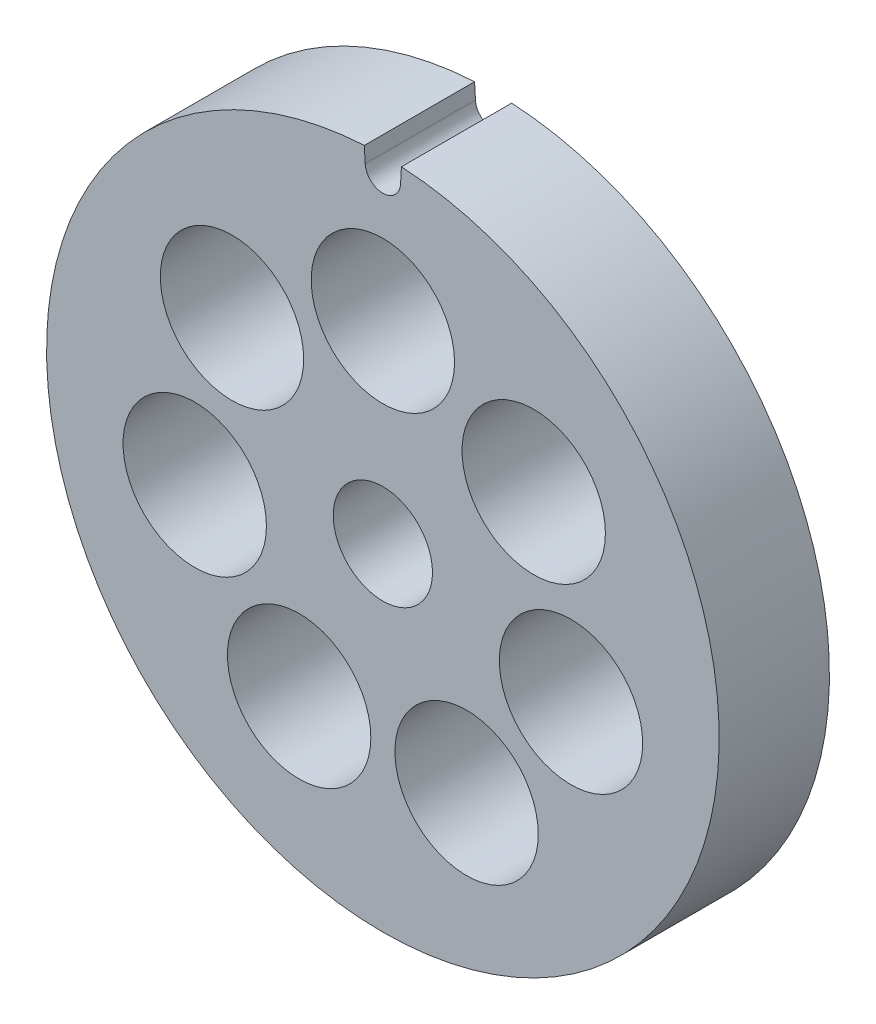
ISO-10303-21;
HEADER;
FILE_DESCRIPTION(('STEP AP214'),'2;1');
FILE_NAME('part.step','',(''),(''),'','','');
FILE_SCHEMA(('AUTOMOTIVE_DESIGN { 1 0 10303 214 1 1 1 1 }'));
ENDSEC;
DATA;
#1=APPLICATION_CONTEXT('core data for automotive mechanical design processes');
#2=APPLICATION_PROTOCOL_DEFINITION('international standard','automotive_design',2000,#1);
#3=PRODUCT_CONTEXT('',#1,'mechanical');
#4=PRODUCT('Part','Part','',(#3));
#5=PRODUCT_RELATED_PRODUCT_CATEGORY('part','',(#4));
#6=PRODUCT_DEFINITION_FORMATION('','',#4);
#7=PRODUCT_DEFINITION_CONTEXT('part definition',#1,'design');
#8=PRODUCT_DEFINITION('design','',#6,#7);
#9=PRODUCT_DEFINITION_SHAPE('','',#8);
#10=(LENGTH_UNIT() NAMED_UNIT(*) SI_UNIT(.MILLI.,.METRE.));
#11=(NAMED_UNIT(*) PLANE_ANGLE_UNIT() SI_UNIT($,.RADIAN.));
#12=(NAMED_UNIT(*) SI_UNIT($,.STERADIAN.) SOLID_ANGLE_UNIT());
#13=UNCERTAINTY_MEASURE_WITH_UNIT(LENGTH_MEASURE(1.E-05),#10,'distance_accuracy_value','');
#14=(GEOMETRIC_REPRESENTATION_CONTEXT(3) GLOBAL_UNCERTAINTY_ASSIGNED_CONTEXT((#13)) GLOBAL_UNIT_ASSIGNED_CONTEXT((#10,
#11,#12)) REPRESENTATION_CONTEXT('',''));
#15=CARTESIAN_POINT('',(0.,0.,0.));
#16=DIRECTION('',(0.,0.,1.));
#17=DIRECTION('',(1.,0.,0.));
#18=AXIS2_PLACEMENT_3D('',#15,#16,#17);
#19=CARTESIAN_POINT('',(0.,0.,10.));
#20=DIRECTION('',(0.,0.,1.));
#21=DIRECTION('',(1.,0.,0.));
#22=AXIS2_PLACEMENT_3D('',#19,#20,#21);
#23=PLANE('',#22);
#24=CARTESIAN_POINT('',(-17.0612384631819,-3.89411634423551,10.));
#25=DIRECTION('',(0.,0.,1.));
#26=DIRECTION('',(1.,0.,0.));
#27=AXIS2_PLACEMENT_3D('',#24,#25,#26);
#28=CIRCLE('',#27,6.50000000000016);
#29=CARTESIAN_POINT('',(-10.5612384631818,-3.89411634423551,10.));
#30=VERTEX_POINT('',#29);
#31=EDGE_CURVE('E145',#30,#30,#28,.T.);
#32=ORIENTED_EDGE('',*,*,#31,.F.);
#33=EDGE_LOOP('',(#32));
#34=FACE_BOUND('',#33,.T.);
#35=CARTESIAN_POINT('',(7.59296543455727,-15.7669551882923,10.));
#36=DIRECTION('',(0.,0.,1.));
#37=DIRECTION('',(1.,0.,0.));
#38=AXIS2_PLACEMENT_3D('',#35,#36,#37);
#39=CIRCLE('',#38,6.5000000000001);
#40=CARTESIAN_POINT('',(14.0929654345574,-15.7669551882923,10.));
#41=VERTEX_POINT('',#40);
#42=EDGE_CURVE('E133',#41,#41,#39,.T.);
#43=ORIENTED_EDGE('',*,*,#42,.F.);
#44=EDGE_LOOP('',(#43));
#45=FACE_BOUND('',#44,.T.);
#46=CARTESIAN_POINT('',(13.6820509431905,10.9110715325278,10.));
#47=DIRECTION('',(0.,0.,1.));
#48=DIRECTION('',(1.,0.,0.));
#49=AXIS2_PLACEMENT_3D('',#46,#47,#48);
#50=CIRCLE('',#49,6.50000000000003);
#51=CARTESIAN_POINT('',(20.1820509431906,10.9110715325278,10.));
#52=VERTEX_POINT('',#51);
#53=EDGE_CURVE('E121',#52,#52,#50,.T.);
#54=ORIENTED_EDGE('',*,*,#53,.F.);
#55=EDGE_LOOP('',(#54));
#56=FACE_BOUND('',#55,.T.);
#57=CARTESIAN_POINT('',(0.,0.,10.));
#58=DIRECTION('',(0.,0.,1.));
#59=DIRECTION('',(1.,0.,0.));
#60=AXIS2_PLACEMENT_3D('',#57,#58,#59);
#61=CIRCLE('',#60,4.5);
#62=CARTESIAN_POINT('',(4.5,0.,10.));
#63=VERTEX_POINT('',#62);
#64=EDGE_CURVE('E100',#63,#63,#61,.T.);
#65=ORIENTED_EDGE('',*,*,#64,.F.);
#66=EDGE_LOOP('',(#65));
#67=FACE_BOUND('',#66,.T.);
#68=CARTESIAN_POINT('',(0.,0.,10.));
#69=DIRECTION('',(0.,0.,1.));
#70=DIRECTION('',(1.,0.,0.));
#71=AXIS2_PLACEMENT_3D('',#68,#69,#70);
#72=CIRCLE('',#71,30.5);
#73=CARTESIAN_POINT('',(-1.68061266357105,30.4536621948009,10.));
#74=VERTEX_POINT('',#73);
#75=CARTESIAN_POINT('',(1.68061266357319,30.4536621948008,10.));
#76=VERTEX_POINT('',#75);
#77=EDGE_CURVE('E85',#74,#76,#72,.T.);
#78=ORIENTED_EDGE('',*,*,#77,.T.);
#79=DIRECTION('',(-0.0551020545433836,-0.998480727698386,0.));
#80=VECTOR('',#79,1.);
#81=CARTESIAN_POINT('',(1.68061266357319,30.4536621948008,10.));
#82=LINE('',#81,#80);
#83=CARTESIAN_POINT('',(1.60335240784591,29.0536621948008,10.));
#84=VERTEX_POINT('',#83);
#85=EDGE_CURVE('E80',#76,#84,#82,.T.);
#86=ORIENTED_EDGE('',*,*,#85,.T.);
#87=CARTESIAN_POINT('',(1.01957017047821E-12,29.1421446355515,10.));
#88=DIRECTION('',(0.,0.,-1.));
#89=DIRECTION('',(1.,0.,0.));
#90=AXIS2_PLACEMENT_3D('',#87,#88,#89);
#91=CIRCLE('',#90,1.60579204321831);
#92=CARTESIAN_POINT('',(-1.60335240784387,29.0536621948009,10.));
#93=VERTEX_POINT('',#92);
#94=EDGE_CURVE('E83',#84,#93,#91,.T.);
#95=ORIENTED_EDGE('',*,*,#94,.T.);
#96=DIRECTION('',(-0.0551020545433132,0.99848072769839,0.));
#97=VECTOR('',#96,1.);
#98=CARTESIAN_POINT('',(-1.68061266357105,30.4536621948009,10.));
#99=LINE('',#98,#97);
#100=EDGE_CURVE('E50',#93,#74,#99,.T.);
#101=ORIENTED_EDGE('',*,*,#100,.T.);
#102=EDGE_LOOP('',(#78,#86,#95,#101));
#103=FACE_BOUND('',#102,.T.);
#104=CARTESIAN_POINT('',(0.,17.5,10.));
#105=DIRECTION('',(0.,0.,1.));
#106=DIRECTION('',(1.,0.,0.));
#107=AXIS2_PLACEMENT_3D('',#104,#105,#106);
#108=CIRCLE('',#107,6.5);
#109=CARTESIAN_POINT('',(6.5,17.5,10.));
#110=VERTEX_POINT('',#109);
#111=EDGE_CURVE('E115',#110,#110,#108,.T.);
#112=ORIENTED_EDGE('',*,*,#111,.F.);
#113=EDGE_LOOP('',(#112));
#114=FACE_BOUND('',#113,.T.);
#115=CARTESIAN_POINT('',(17.0612384631819,-3.8941163442355,10.));
#116=DIRECTION('',(0.,0.,1.));
#117=DIRECTION('',(1.,0.,0.));
#118=AXIS2_PLACEMENT_3D('',#115,#116,#117);
#119=CIRCLE('',#118,6.50000000000007);
#120=CARTESIAN_POINT('',(23.561238463182,-3.8941163442355,10.));
#121=VERTEX_POINT('',#120);
#122=EDGE_CURVE('E127',#121,#121,#119,.T.);
#123=ORIENTED_EDGE('',*,*,#122,.F.);
#124=EDGE_LOOP('',(#123));
#125=FACE_BOUND('',#124,.T.);
#126=CARTESIAN_POINT('',(-7.59296543455727,-15.7669551882923,10.));
#127=DIRECTION('',(0.,0.,1.));
#128=DIRECTION('',(1.,0.,0.));
#129=AXIS2_PLACEMENT_3D('',#126,#127,#128);
#130=CIRCLE('',#129,6.50000000000013);
#131=CARTESIAN_POINT('',(-1.09296543455713,-15.7669551882923,10.));
#132=VERTEX_POINT('',#131);
#133=EDGE_CURVE('E139',#132,#132,#130,.T.);
#134=ORIENTED_EDGE('',*,*,#133,.F.);
#135=EDGE_LOOP('',(#134));
#136=FACE_BOUND('',#135,.T.);
#137=CARTESIAN_POINT('',(-13.6820509431905,10.9110715325278,10.));
#138=DIRECTION('',(0.,0.,1.));
#139=DIRECTION('',(1.,0.,0.));
#140=AXIS2_PLACEMENT_3D('',#137,#138,#139);
#141=CIRCLE('',#140,6.50000000000021);
#142=CARTESIAN_POINT('',(-7.18205094319032,10.9110715325278,10.));
#143=VERTEX_POINT('',#142);
#144=EDGE_CURVE('E151',#143,#143,#141,.T.);
#145=ORIENTED_EDGE('',*,*,#144,.F.);
#146=EDGE_LOOP('',(#145));
#147=FACE_BOUND('',#146,.T.);
#148=ADVANCED_FACE('F33',(#34,#45,#56,#67,#103,#114,#125,#136,#147),#23,.T.);
#149=CARTESIAN_POINT('',(0.,0.,0.));
#150=DIRECTION('',(0.,0.,1.));
#151=DIRECTION('',(1.,0.,0.));
#152=AXIS2_PLACEMENT_3D('',#149,#150,#151);
#153=PLANE('',#152);
#154=CARTESIAN_POINT('',(0.,0.,0.));
#155=DIRECTION('',(0.,0.,1.));
#156=DIRECTION('',(1.,0.,0.));
#157=AXIS2_PLACEMENT_3D('',#154,#155,#156);
#158=CIRCLE('',#157,30.5);
#159=CARTESIAN_POINT('',(-1.68061266357105,30.4536621948009,0.));
#160=VERTEX_POINT('',#159);
#161=CARTESIAN_POINT('',(1.68061266357319,30.4536621948008,0.));
#162=VERTEX_POINT('',#161);
#163=EDGE_CURVE('E97',#160,#162,#158,.T.);
#164=ORIENTED_EDGE('',*,*,#163,.F.);
#165=DIRECTION('',(-0.0551020545433132,0.99848072769839,0.));
#166=VECTOR('',#165,1.);
#167=CARTESIAN_POINT('',(-1.68061266357105,30.4536621948009,0.));
#168=LINE('',#167,#166);
#169=CARTESIAN_POINT('',(-1.60335240784387,29.0536621948009,0.));
#170=VERTEX_POINT('',#169);
#171=EDGE_CURVE('E73',#170,#160,#168,.T.);
#172=ORIENTED_EDGE('',*,*,#171,.F.);
#173=CARTESIAN_POINT('',(1.01957017047821E-12,29.1421446355515,0.));
#174=DIRECTION('',(0.,0.,-1.));
#175=DIRECTION('',(1.,0.,0.));
#176=AXIS2_PLACEMENT_3D('',#173,#174,#175);
#177=CIRCLE('',#176,1.60579204321831);
#178=CARTESIAN_POINT('',(1.60335240784591,29.0536621948008,0.));
#179=VERTEX_POINT('',#178);
#180=EDGE_CURVE('E67',#179,#170,#177,.T.);
#181=ORIENTED_EDGE('',*,*,#180,.F.);
#182=DIRECTION('',(-0.0551020545433836,-0.998480727698386,0.));
#183=VECTOR('',#182,1.);
#184=CARTESIAN_POINT('',(1.68061266357319,30.4536621948008,0.));
#185=LINE('',#184,#183);
#186=EDGE_CURVE('E89',#162,#179,#185,.T.);
#187=ORIENTED_EDGE('',*,*,#186,.F.);
#188=EDGE_LOOP('',(#164,#172,#181,#187));
#189=FACE_BOUND('',#188,.T.);
#190=CARTESIAN_POINT('',(0.,0.,0.));
#191=DIRECTION('',(0.,0.,1.));
#192=DIRECTION('',(1.,0.,0.));
#193=AXIS2_PLACEMENT_3D('',#190,#191,#192);
#194=CIRCLE('',#193,4.5);
#195=CARTESIAN_POINT('',(4.5,0.,0.));
#196=VERTEX_POINT('',#195);
#197=EDGE_CURVE('E112',#196,#196,#194,.T.);
#198=ORIENTED_EDGE('',*,*,#197,.T.);
#199=EDGE_LOOP('',(#198));
#200=FACE_BOUND('',#199,.T.);
#201=CARTESIAN_POINT('',(0.,17.5,0.));
#202=DIRECTION('',(0.,0.,1.));
#203=DIRECTION('',(1.,0.,0.));
#204=AXIS2_PLACEMENT_3D('',#201,#202,#203);
#205=CIRCLE('',#204,6.5);
#206=CARTESIAN_POINT('',(6.5,17.5,0.));
#207=VERTEX_POINT('',#206);
#208=EDGE_CURVE('E118',#207,#207,#205,.T.);
#209=ORIENTED_EDGE('',*,*,#208,.T.);
#210=EDGE_LOOP('',(#209));
#211=FACE_BOUND('',#210,.T.);
#212=CARTESIAN_POINT('',(13.6820509431905,10.9110715325278,0.));
#213=DIRECTION('',(0.,0.,1.));
#214=DIRECTION('',(1.,0.,0.));
#215=AXIS2_PLACEMENT_3D('',#212,#213,#214);
#216=CIRCLE('',#215,6.50000000000003);
#217=CARTESIAN_POINT('',(20.1820509431906,10.9110715325278,0.));
#218=VERTEX_POINT('',#217);
#219=EDGE_CURVE('E124',#218,#218,#216,.T.);
#220=ORIENTED_EDGE('',*,*,#219,.T.);
#221=EDGE_LOOP('',(#220));
#222=FACE_BOUND('',#221,.T.);
#223=CARTESIAN_POINT('',(17.0612384631819,-3.8941163442355,0.));
#224=DIRECTION('',(0.,0.,1.));
#225=DIRECTION('',(1.,0.,0.));
#226=AXIS2_PLACEMENT_3D('',#223,#224,#225);
#227=CIRCLE('',#226,6.50000000000007);
#228=CARTESIAN_POINT('',(23.561238463182,-3.8941163442355,0.));
#229=VERTEX_POINT('',#228);
#230=EDGE_CURVE('E130',#229,#229,#227,.T.);
#231=ORIENTED_EDGE('',*,*,#230,.T.);
#232=EDGE_LOOP('',(#231));
#233=FACE_BOUND('',#232,.T.);
#234=CARTESIAN_POINT('',(7.59296543455727,-15.7669551882923,0.));
#235=DIRECTION('',(0.,0.,1.));
#236=DIRECTION('',(1.,0.,0.));
#237=AXIS2_PLACEMENT_3D('',#234,#235,#236);
#238=CIRCLE('',#237,6.5000000000001);
#239=CARTESIAN_POINT('',(14.0929654345574,-15.7669551882923,0.));
#240=VERTEX_POINT('',#239);
#241=EDGE_CURVE('E136',#240,#240,#238,.T.);
#242=ORIENTED_EDGE('',*,*,#241,.T.);
#243=EDGE_LOOP('',(#242));
#244=FACE_BOUND('',#243,.T.);
#245=CARTESIAN_POINT('',(-7.59296543455727,-15.7669551882923,0.));
#246=DIRECTION('',(0.,0.,1.));
#247=DIRECTION('',(1.,0.,0.));
#248=AXIS2_PLACEMENT_3D('',#245,#246,#247);
#249=CIRCLE('',#248,6.50000000000013);
#250=CARTESIAN_POINT('',(-1.09296543455713,-15.7669551882923,0.));
#251=VERTEX_POINT('',#250);
#252=EDGE_CURVE('E142',#251,#251,#249,.T.);
#253=ORIENTED_EDGE('',*,*,#252,.T.);
#254=EDGE_LOOP('',(#253));
#255=FACE_BOUND('',#254,.T.);
#256=CARTESIAN_POINT('',(-17.0612384631819,-3.89411634423551,0.));
#257=DIRECTION('',(0.,0.,1.));
#258=DIRECTION('',(1.,0.,0.));
#259=AXIS2_PLACEMENT_3D('',#256,#257,#258);
#260=CIRCLE('',#259,6.50000000000016);
#261=CARTESIAN_POINT('',(-10.5612384631818,-3.89411634423551,0.));
#262=VERTEX_POINT('',#261);
#263=EDGE_CURVE('E148',#262,#262,#260,.T.);
#264=ORIENTED_EDGE('',*,*,#263,.T.);
#265=EDGE_LOOP('',(#264));
#266=FACE_BOUND('',#265,.T.);
#267=CARTESIAN_POINT('',(-13.6820509431905,10.9110715325278,0.));
#268=DIRECTION('',(0.,0.,1.));
#269=DIRECTION('',(1.,0.,0.));
#270=AXIS2_PLACEMENT_3D('',#267,#268,#269);
#271=CIRCLE('',#270,6.50000000000021);
#272=CARTESIAN_POINT('',(-7.18205094319032,10.9110715325278,0.));
#273=VERTEX_POINT('',#272);
#274=EDGE_CURVE('E154',#273,#273,#271,.T.);
#275=ORIENTED_EDGE('',*,*,#274,.T.);
#276=EDGE_LOOP('',(#275));
#277=FACE_BOUND('',#276,.T.);
#278=ADVANCED_FACE('F108',(#189,#200,#211,#222,#233,#244,#255,#266,#277),#153,.F.);
#279=CARTESIAN_POINT('',(0.,0.,10.));
#280=DIRECTION('',(0.,0.,-1.));
#281=DIRECTION('',(-1.,0.,0.));
#282=AXIS2_PLACEMENT_3D('',#279,#280,#281);
#283=CYLINDRICAL_SURFACE('',#282,30.5);
#284=ORIENTED_EDGE('',*,*,#163,.T.);
#285=DIRECTION('',(0.,0.,-1.));
#286=VECTOR('',#285,1.);
#287=CARTESIAN_POINT('',(1.68061266357319,30.4536621948008,10.));
#288=LINE('',#287,#286);
#289=EDGE_CURVE('E11',#76,#162,#288,.T.);
#290=ORIENTED_EDGE('',*,*,#289,.F.);
#291=ORIENTED_EDGE('',*,*,#77,.F.);
#292=DIRECTION('',(0.,0.,-1.));
#293=VECTOR('',#292,1.);
#294=CARTESIAN_POINT('',(-1.68061266357105,30.4536621948009,10.));
#295=LINE('',#294,#293);
#296=EDGE_CURVE('E93',#74,#160,#295,.T.);
#297=ORIENTED_EDGE('',*,*,#296,.T.);
#298=EDGE_LOOP('',(#284,#290,#291,#297));
#299=FACE_BOUND('',#298,.T.);
#300=ADVANCED_FACE('F35',(#299),#283,.T.);
#301=CARTESIAN_POINT('',(1.68061266357319,30.4536621948008,10.));
#302=DIRECTION('',(0.998480727698386,-0.0551020545433836,0.));
#303=DIRECTION('',(0.0551020545433836,0.998480727698386,0.));
#304=AXIS2_PLACEMENT_3D('',#301,#302,#303);
#305=PLANE('',#304);
#306=ORIENTED_EDGE('',*,*,#186,.T.);
#307=DIRECTION('',(0.,0.,-1.));
#308=VECTOR('',#307,1.);
#309=CARTESIAN_POINT('',(1.60335240784591,29.0536621948008,10.));
#310=LINE('',#309,#308);
#311=EDGE_CURVE('E42',#84,#179,#310,.T.);
#312=ORIENTED_EDGE('',*,*,#311,.F.);
#313=ORIENTED_EDGE('',*,*,#85,.F.);
#314=ORIENTED_EDGE('',*,*,#289,.T.);
#315=EDGE_LOOP('',(#306,#312,#313,#314));
#316=FACE_BOUND('',#315,.T.);
#317=ADVANCED_FACE('F88',(#316),#305,.F.);
#318=CARTESIAN_POINT('',(1.01957017047821E-12,29.1421446355515,10.));
#319=DIRECTION('',(0.,0.,-1.));
#320=DIRECTION('',(-1.,0.,0.));
#321=AXIS2_PLACEMENT_3D('',#318,#319,#320);
#322=CYLINDRICAL_SURFACE('',#321,1.60579204321831);
#323=ORIENTED_EDGE('',*,*,#180,.T.);
#324=DIRECTION('',(0.,0.,-1.));
#325=VECTOR('',#324,1.);
#326=CARTESIAN_POINT('',(-1.60335240784387,29.0536621948009,10.));
#327=LINE('',#326,#325);
#328=EDGE_CURVE('E90',#93,#170,#327,.T.);
#329=ORIENTED_EDGE('',*,*,#328,.F.);
#330=ORIENTED_EDGE('',*,*,#94,.F.);
#331=ORIENTED_EDGE('',*,*,#311,.T.);
#332=EDGE_LOOP('',(#323,#329,#330,#331));
#333=FACE_BOUND('',#332,.T.);
#334=ADVANCED_FACE('F91',(#333),#322,.F.);
#335=CARTESIAN_POINT('',(-1.68061266357105,30.4536621948009,10.));
#336=DIRECTION('',(-0.99848072769839,-0.0551020545433133,0.));
#337=DIRECTION('',(0.0551020545433133,-0.99848072769839,0.));
#338=AXIS2_PLACEMENT_3D('',#335,#336,#337);
#339=PLANE('',#338);
#340=ORIENTED_EDGE('',*,*,#171,.T.);
#341=ORIENTED_EDGE('',*,*,#296,.F.);
#342=ORIENTED_EDGE('',*,*,#100,.F.);
#343=ORIENTED_EDGE('',*,*,#328,.T.);
#344=EDGE_LOOP('',(#340,#341,#342,#343));
#345=FACE_BOUND('',#344,.T.);
#346=ADVANCED_FACE('F105',(#345),#339,.F.);
#347=CARTESIAN_POINT('',(0.,0.,10.));
#348=DIRECTION('',(0.,0.,-1.));
#349=DIRECTION('',(-1.,0.,0.));
#350=AXIS2_PLACEMENT_3D('',#347,#348,#349);
#351=CYLINDRICAL_SURFACE('',#350,4.5);
#352=ORIENTED_EDGE('',*,*,#64,.T.);
#353=EDGE_LOOP('',(#352));
#354=FACE_BOUND('',#353,.T.);
#355=ORIENTED_EDGE('',*,*,#197,.F.);
#356=EDGE_LOOP('',(#355));
#357=FACE_BOUND('',#356,.T.);
#358=ADVANCED_FACE('F173',(#354,#357),#351,.F.);
#359=CARTESIAN_POINT('',(0.,17.5,10.));
#360=DIRECTION('',(0.,0.,-1.));
#361=DIRECTION('',(-1.,0.,0.));
#362=AXIS2_PLACEMENT_3D('',#359,#360,#361);
#363=CYLINDRICAL_SURFACE('',#362,6.5);
#364=ORIENTED_EDGE('',*,*,#111,.T.);
#365=EDGE_LOOP('',(#364));
#366=FACE_BOUND('',#365,.T.);
#367=ORIENTED_EDGE('',*,*,#208,.F.);
#368=EDGE_LOOP('',(#367));
#369=FACE_BOUND('',#368,.T.);
#370=ADVANCED_FACE('F219',(#366,#369),#363,.F.);
#371=CARTESIAN_POINT('',(13.6820509431905,10.9110715325278,10.));
#372=DIRECTION('',(0.,0.,-1.));
#373=DIRECTION('',(-1.,0.,0.));
#374=AXIS2_PLACEMENT_3D('',#371,#372,#373);
#375=CYLINDRICAL_SURFACE('',#374,6.50000000000003);
#376=ORIENTED_EDGE('',*,*,#53,.T.);
#377=EDGE_LOOP('',(#376));
#378=FACE_BOUND('',#377,.T.);
#379=ORIENTED_EDGE('',*,*,#219,.F.);
#380=EDGE_LOOP('',(#379));
#381=FACE_BOUND('',#380,.T.);
#382=ADVANCED_FACE('F227',(#378,#381),#375,.F.);
#383=CARTESIAN_POINT('',(17.0612384631819,-3.8941163442355,10.));
#384=DIRECTION('',(0.,0.,-1.));
#385=DIRECTION('',(-1.,0.,0.));
#386=AXIS2_PLACEMENT_3D('',#383,#384,#385);
#387=CYLINDRICAL_SURFACE('',#386,6.50000000000007);
#388=ORIENTED_EDGE('',*,*,#122,.T.);
#389=EDGE_LOOP('',(#388));
#390=FACE_BOUND('',#389,.T.);
#391=ORIENTED_EDGE('',*,*,#230,.F.);
#392=EDGE_LOOP('',(#391));
#393=FACE_BOUND('',#392,.T.);
#394=ADVANCED_FACE('F235',(#390,#393),#387,.F.);
#395=CARTESIAN_POINT('',(7.59296543455727,-15.7669551882923,10.));
#396=DIRECTION('',(0.,0.,-1.));
#397=DIRECTION('',(-1.,0.,0.));
#398=AXIS2_PLACEMENT_3D('',#395,#396,#397);
#399=CYLINDRICAL_SURFACE('',#398,6.5000000000001);
#400=ORIENTED_EDGE('',*,*,#42,.T.);
#401=EDGE_LOOP('',(#400));
#402=FACE_BOUND('',#401,.T.);
#403=ORIENTED_EDGE('',*,*,#241,.F.);
#404=EDGE_LOOP('',(#403));
#405=FACE_BOUND('',#404,.T.);
#406=ADVANCED_FACE('F244',(#402,#405),#399,.F.);
#407=CARTESIAN_POINT('',(-7.59296543455727,-15.7669551882923,10.));
#408=DIRECTION('',(0.,0.,-1.));
#409=DIRECTION('',(-1.,0.,0.));
#410=AXIS2_PLACEMENT_3D('',#407,#408,#409);
#411=CYLINDRICAL_SURFACE('',#410,6.50000000000013);
#412=ORIENTED_EDGE('',*,*,#133,.T.);
#413=EDGE_LOOP('',(#412));
#414=FACE_BOUND('',#413,.T.);
#415=ORIENTED_EDGE('',*,*,#252,.F.);
#416=EDGE_LOOP('',(#415));
#417=FACE_BOUND('',#416,.T.);
#418=ADVANCED_FACE('F253',(#414,#417),#411,.F.);
#419=CARTESIAN_POINT('',(-17.0612384631819,-3.89411634423551,10.));
#420=DIRECTION('',(0.,0.,-1.));
#421=DIRECTION('',(-1.,0.,0.));
#422=AXIS2_PLACEMENT_3D('',#419,#420,#421);
#423=CYLINDRICAL_SURFACE('',#422,6.50000000000016);
#424=ORIENTED_EDGE('',*,*,#31,.T.);
#425=EDGE_LOOP('',(#424));
#426=FACE_BOUND('',#425,.T.);
#427=ORIENTED_EDGE('',*,*,#263,.F.);
#428=EDGE_LOOP('',(#427));
#429=FACE_BOUND('',#428,.T.);
#430=ADVANCED_FACE('F262',(#426,#429),#423,.F.);
#431=CARTESIAN_POINT('',(-13.6820509431905,10.9110715325278,10.));
#432=DIRECTION('',(0.,0.,-1.));
#433=DIRECTION('',(-1.,0.,0.));
#434=AXIS2_PLACEMENT_3D('',#431,#432,#433);
#435=CYLINDRICAL_SURFACE('',#434,6.50000000000021);
#436=ORIENTED_EDGE('',*,*,#144,.T.);
#437=EDGE_LOOP('',(#436));
#438=FACE_BOUND('',#437,.T.);
#439=ORIENTED_EDGE('',*,*,#274,.F.);
#440=EDGE_LOOP('',(#439));
#441=FACE_BOUND('',#440,.T.);
#442=ADVANCED_FACE('F160',(#438,#441),#435,.F.);
#443=CLOSED_SHELL('',(#148,#278,#300,#317,#334,#346,#358,#370,#382,#394,#406,#418,#430,#442));
#444=MANIFOLD_SOLID_BREP('B2',#443);
#445=ADVANCED_BREP_SHAPE_REPRESENTATION('',(#18,#444),#14);
#446=SHAPE_DEFINITION_REPRESENTATION(#9,#445);
ENDSEC;
END-ISO-10303-21;
